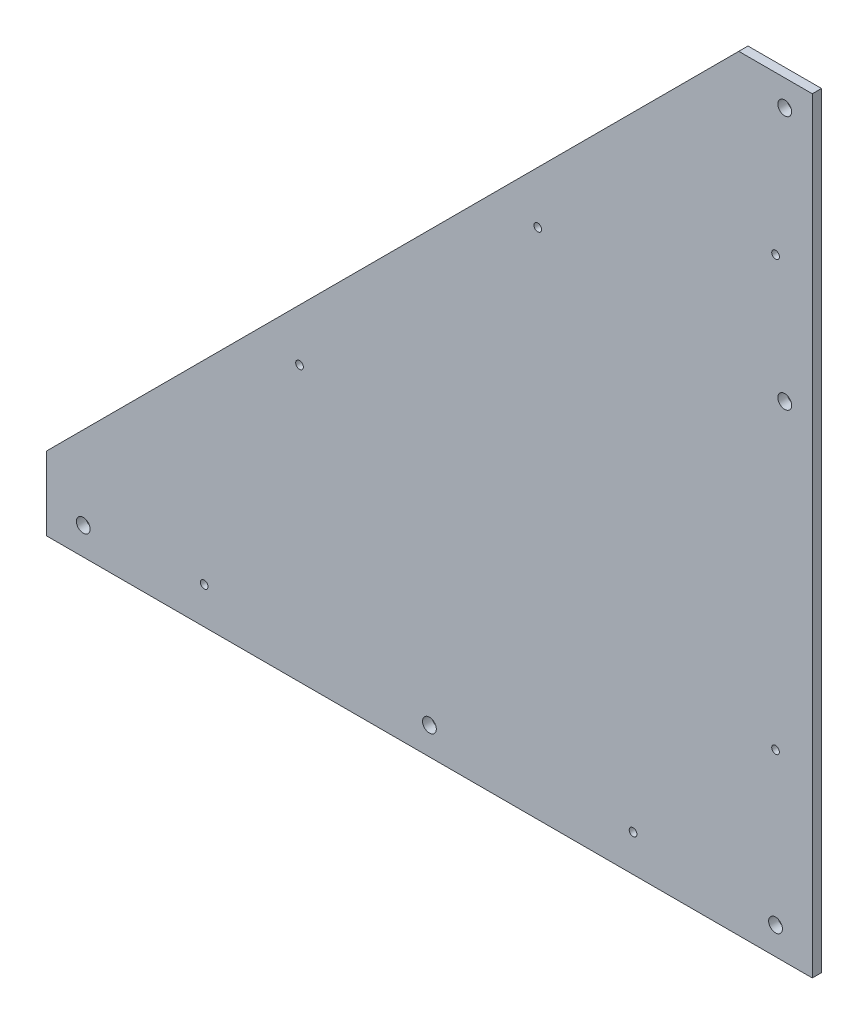
ISO-10303-21;
HEADER;
FILE_DESCRIPTION(('STEP AP214'),'2;1');
FILE_NAME('part.step','',(''),(''),'','','');
FILE_SCHEMA(('AUTOMOTIVE_DESIGN { 1 0 10303 214 1 1 1 1 }'));
ENDSEC;
DATA;
#1=APPLICATION_CONTEXT('core data for automotive mechanical design processes');
#2=APPLICATION_PROTOCOL_DEFINITION('international standard','automotive_design',2000,#1);
#3=PRODUCT_CONTEXT('',#1,'mechanical');
#4=PRODUCT('Part','Part','',(#3));
#5=PRODUCT_RELATED_PRODUCT_CATEGORY('part','',(#4));
#6=PRODUCT_DEFINITION_FORMATION('','',#4);
#7=PRODUCT_DEFINITION_CONTEXT('part definition',#1,'design');
#8=PRODUCT_DEFINITION('design','',#6,#7);
#9=PRODUCT_DEFINITION_SHAPE('','',#8);
#10=(LENGTH_UNIT() NAMED_UNIT(*) SI_UNIT(.MILLI.,.METRE.));
#11=(NAMED_UNIT(*) PLANE_ANGLE_UNIT() SI_UNIT($,.RADIAN.));
#12=(NAMED_UNIT(*) SI_UNIT($,.STERADIAN.) SOLID_ANGLE_UNIT());
#13=UNCERTAINTY_MEASURE_WITH_UNIT(LENGTH_MEASURE(1.E-05),#10,'distance_accuracy_value','');
#14=(GEOMETRIC_REPRESENTATION_CONTEXT(3) GLOBAL_UNCERTAINTY_ASSIGNED_CONTEXT((#13)) GLOBAL_UNIT_ASSIGNED_CONTEXT((#10,
#11,#12)) REPRESENTATION_CONTEXT('',''));
#15=CARTESIAN_POINT('',(0.,0.,0.));
#16=DIRECTION('',(0.,0.,1.));
#17=DIRECTION('',(1.,0.,0.));
#18=AXIS2_PLACEMENT_3D('',#15,#16,#17);
#19=CARTESIAN_POINT('',(500.,0.,6.00000000000001));
#20=DIRECTION('',(0.,1.,0.));
#21=DIRECTION('',(-1.,0.,0.));
#22=AXIS2_PLACEMENT_3D('',#19,#20,#21);
#23=PLANE('',#22);
#24=DIRECTION('',(1.,0.,0.));
#25=VECTOR('',#24,1.);
#26=CARTESIAN_POINT('',(500.,0.,0.));
#27=LINE('',#26,#25);
#28=CARTESIAN_POINT('',(0.,0.,0.));
#29=VERTEX_POINT('',#28);
#30=CARTESIAN_POINT('',(500.,0.,0.));
#31=VERTEX_POINT('',#30);
#32=EDGE_CURVE('E131',#29,#31,#27,.T.);
#33=ORIENTED_EDGE('',*,*,#32,.T.);
#34=DIRECTION('',(0.,0.,-1.));
#35=VECTOR('',#34,1.);
#36=CARTESIAN_POINT('',(500.,0.,6.00000000000001));
#37=LINE('',#36,#35);
#38=CARTESIAN_POINT('',(500.,0.,6.00000000000001));
#39=VERTEX_POINT('',#38);
#40=EDGE_CURVE('E152',#39,#31,#37,.T.);
#41=ORIENTED_EDGE('',*,*,#40,.F.);
#42=DIRECTION('',(1.,0.,0.));
#43=VECTOR('',#42,1.);
#44=CARTESIAN_POINT('',(500.,0.,6.00000000000001));
#45=LINE('',#44,#43);
#46=CARTESIAN_POINT('',(0.,0.,6.00000000000001));
#47=VERTEX_POINT('',#46);
#48=EDGE_CURVE('E145',#47,#39,#45,.T.);
#49=ORIENTED_EDGE('',*,*,#48,.F.);
#50=DIRECTION('',(0.,0.,-1.));
#51=VECTOR('',#50,1.);
#52=CARTESIAN_POINT('',(0.,0.,6.00000000000001));
#53=LINE('',#52,#51);
#54=EDGE_CURVE('E127',#47,#29,#53,.T.);
#55=ORIENTED_EDGE('',*,*,#54,.T.);
#56=EDGE_LOOP('',(#33,#41,#49,#55));
#57=FACE_BOUND('',#56,.T.);
#58=ADVANCED_FACE('F47',(#57),#23,.F.);
#59=CARTESIAN_POINT('',(500.,499.999999999995,6.00000000000001));
#60=DIRECTION('',(-1.,0.,0.));
#61=DIRECTION('',(0.,-1.,0.));
#62=AXIS2_PLACEMENT_3D('',#59,#60,#61);
#63=PLANE('',#62);
#64=DIRECTION('',(0.,1.,0.));
#65=VECTOR('',#64,1.);
#66=CARTESIAN_POINT('',(500.,499.999999999995,0.));
#67=LINE('',#66,#65);
#68=CARTESIAN_POINT('',(500.,499.999999999995,0.));
#69=VERTEX_POINT('',#68);
#70=EDGE_CURVE('E135',#31,#69,#67,.T.);
#71=ORIENTED_EDGE('',*,*,#70,.T.);
#72=DIRECTION('',(0.,0.,-1.));
#73=VECTOR('',#72,1.);
#74=CARTESIAN_POINT('',(500.,499.999999999995,6.00000000000001));
#75=LINE('',#74,#73);
#76=CARTESIAN_POINT('',(500.,499.999999999995,6.00000000000001));
#77=VERTEX_POINT('',#76);
#78=EDGE_CURVE('E119',#77,#69,#75,.T.);
#79=ORIENTED_EDGE('',*,*,#78,.F.);
#80=DIRECTION('',(0.,1.,0.));
#81=VECTOR('',#80,1.);
#82=CARTESIAN_POINT('',(500.,499.999999999995,6.00000000000001));
#83=LINE('',#82,#81);
#84=EDGE_CURVE('E101',#39,#77,#83,.T.);
#85=ORIENTED_EDGE('',*,*,#84,.F.);
#86=ORIENTED_EDGE('',*,*,#40,.T.);
#87=EDGE_LOOP('',(#71,#79,#85,#86));
#88=FACE_BOUND('',#87,.T.);
#89=ADVANCED_FACE('F250',(#88),#63,.F.);
#90=CARTESIAN_POINT('',(452.,499.999999999995,5.99999999999995));
#91=DIRECTION('',(0.,-1.,0.));
#92=DIRECTION('',(1.,0.,0.));
#93=AXIS2_PLACEMENT_3D('',#90,#91,#92);
#94=PLANE('',#93);
#95=DIRECTION('',(-1.,0.,0.));
#96=VECTOR('',#95,1.);
#97=CARTESIAN_POINT('',(452.,499.999999999995,-1.66533453693773E-13));
#98=LINE('',#97,#96);
#99=CARTESIAN_POINT('',(452.,499.999999999995,-1.66533453693773E-13));
#100=VERTEX_POINT('',#99);
#101=EDGE_CURVE('E117',#69,#100,#98,.T.);
#102=ORIENTED_EDGE('',*,*,#101,.T.);
#103=DIRECTION('',(0.,0.,-1.));
#104=VECTOR('',#103,1.);
#105=CARTESIAN_POINT('',(452.,499.999999999995,5.99999999999995));
#106=LINE('',#105,#104);
#107=CARTESIAN_POINT('',(452.,499.999999999995,5.99999999999995));
#108=VERTEX_POINT('',#107);
#109=EDGE_CURVE('E114',#108,#100,#106,.T.);
#110=ORIENTED_EDGE('',*,*,#109,.F.);
#111=DIRECTION('',(-1.,0.,0.));
#112=VECTOR('',#111,1.);
#113=CARTESIAN_POINT('',(452.,499.999999999995,5.99999999999995));
#114=LINE('',#113,#112);
#115=EDGE_CURVE('E105',#77,#108,#114,.T.);
#116=ORIENTED_EDGE('',*,*,#115,.F.);
#117=ORIENTED_EDGE('',*,*,#78,.T.);
#118=EDGE_LOOP('',(#102,#110,#116,#117));
#119=FACE_BOUND('',#118,.T.);
#120=ADVANCED_FACE('F115',(#119),#94,.F.);
#121=CARTESIAN_POINT('',(0.,48.,6.00000000000001));
#122=DIRECTION('',(0.707106781186544,-0.707106781186551,0.));
#123=DIRECTION('',(0.707106781186551,0.707106781186544,0.));
#124=AXIS2_PLACEMENT_3D('',#121,#122,#123);
#125=PLANE('',#124);
#126=DIRECTION('',(-0.707106781186551,-0.707106781186544,0.));
#127=VECTOR('',#126,1.);
#128=CARTESIAN_POINT('',(0.,48.,0.));
#129=LINE('',#128,#127);
#130=CARTESIAN_POINT('',(0.,48.,0.));
#131=VERTEX_POINT('',#130);
#132=EDGE_CURVE('E86',#100,#131,#129,.T.);
#133=ORIENTED_EDGE('',*,*,#132,.T.);
#134=DIRECTION('',(0.,0.,-1.));
#135=VECTOR('',#134,1.);
#136=CARTESIAN_POINT('',(0.,48.,6.00000000000001));
#137=LINE('',#136,#135);
#138=CARTESIAN_POINT('',(0.,48.,6.00000000000001));
#139=VERTEX_POINT('',#138);
#140=EDGE_CURVE('E120',#139,#131,#137,.T.);
#141=ORIENTED_EDGE('',*,*,#140,.F.);
#142=DIRECTION('',(-0.707106781186551,-0.707106781186544,0.));
#143=VECTOR('',#142,1.);
#144=CARTESIAN_POINT('',(0.,48.,6.00000000000001));
#145=LINE('',#144,#143);
#146=EDGE_CURVE('E109',#108,#139,#145,.T.);
#147=ORIENTED_EDGE('',*,*,#146,.F.);
#148=ORIENTED_EDGE('',*,*,#109,.T.);
#149=EDGE_LOOP('',(#133,#141,#147,#148));
#150=FACE_BOUND('',#149,.T.);
#151=ADVANCED_FACE('F122',(#150),#125,.F.);
#152=CARTESIAN_POINT('',(0.,0.,6.00000000000001));
#153=DIRECTION('',(1.,0.,0.));
#154=DIRECTION('',(0.,0.,-1.));
#155=AXIS2_PLACEMENT_3D('',#152,#153,#154);
#156=PLANE('',#155);
#157=DIRECTION('',(0.,-1.,0.));
#158=VECTOR('',#157,1.);
#159=CARTESIAN_POINT('',(0.,0.,0.));
#160=LINE('',#159,#158);
#161=EDGE_CURVE('E92',#131,#29,#160,.T.);
#162=ORIENTED_EDGE('',*,*,#161,.T.);
#163=ORIENTED_EDGE('',*,*,#54,.F.);
#164=DIRECTION('',(0.,-1.,0.));
#165=VECTOR('',#164,1.);
#166=CARTESIAN_POINT('',(0.,0.,6.00000000000001));
#167=LINE('',#166,#165);
#168=EDGE_CURVE('E66',#139,#47,#167,.T.);
#169=ORIENTED_EDGE('',*,*,#168,.F.);
#170=ORIENTED_EDGE('',*,*,#140,.T.);
#171=EDGE_LOOP('',(#162,#163,#169,#170));
#172=FACE_BOUND('',#171,.T.);
#173=ADVANCED_FACE('F239',(#172),#156,.F.);
#174=CARTESIAN_POINT('',(0.,0.,6.00000000000001));
#175=DIRECTION('',(0.,0.,-1.));
#176=DIRECTION('',(-1.,0.,0.));
#177=AXIS2_PLACEMENT_3D('',#174,#175,#176);
#178=PLANE('',#177);
#179=CARTESIAN_POINT('',(320.752308679,334.811183182041,6.00000000000001));
#180=DIRECTION('',(0.,0.,1.));
#181=DIRECTION('',(1.,0.,0.));
#182=AXIS2_PLACEMENT_3D('',#179,#180,#181);
#183=CIRCLE('',#182,2.50000000000002);
#184=CARTESIAN_POINT('',(323.252308679,334.811183182041,6.00000000000001));
#185=VERTEX_POINT('',#184);
#186=EDGE_CURVE('E307',#185,#185,#183,.T.);
#187=ORIENTED_EDGE('',*,*,#186,.F.);
#188=EDGE_LOOP('',(#187));
#189=FACE_BOUND('',#188,.T.);
#190=CARTESIAN_POINT('',(102.97056274848,23.9999999999999,5.99999999999984));
#191=DIRECTION('',(0.,0.,1.));
#192=DIRECTION('',(1.,0.,0.));
#193=AXIS2_PLACEMENT_3D('',#190,#191,#192);
#194=CIRCLE('',#193,2.5);
#195=CARTESIAN_POINT('',(105.47056274848,23.9999999999999,5.99999999999984));
#196=VERTEX_POINT('',#195);
#197=EDGE_CURVE('E315',#196,#196,#194,.T.);
#198=ORIENTED_EDGE('',*,*,#197,.F.);
#199=EDGE_LOOP('',(#198));
#200=FACE_BOUND('',#199,.T.);
#201=CARTESIAN_POINT('',(382.970562748479,24.,5.99999999999984));
#202=DIRECTION('',(0.,0.,1.));
#203=DIRECTION('',(1.,0.,0.));
#204=AXIS2_PLACEMENT_3D('',#201,#202,#203);
#205=CIRCLE('',#204,2.50000000000002);
#206=CARTESIAN_POINT('',(385.470562748479,24.,5.99999999999984));
#207=VERTEX_POINT('',#206);
#208=EDGE_CURVE('E421',#207,#207,#205,.T.);
#209=ORIENTED_EDGE('',*,*,#208,.F.);
#210=EDGE_LOOP('',(#209));
#211=FACE_BOUND('',#210,.T.);
#212=CARTESIAN_POINT('',(476.,397.029437251521,6.00000000000001));
#213=DIRECTION('',(0.,0.,1.));
#214=DIRECTION('',(1.,0.,0.));
#215=AXIS2_PLACEMENT_3D('',#212,#213,#214);
#216=CIRCLE('',#215,2.50000000000002);
#217=CARTESIAN_POINT('',(478.5,397.029437251521,6.00000000000001));
#218=VERTEX_POINT('',#217);
#219=EDGE_CURVE('E319',#218,#218,#216,.T.);
#220=ORIENTED_EDGE('',*,*,#219,.F.);
#221=EDGE_LOOP('',(#220));
#222=FACE_BOUND('',#221,.T.);
#223=CARTESIAN_POINT('',(476.,117.029437251521,6.00000000000001));
#224=DIRECTION('',(0.,0.,1.));
#225=DIRECTION('',(1.,0.,0.));
#226=AXIS2_PLACEMENT_3D('',#223,#224,#225);
#227=CIRCLE('',#226,2.50000000000002);
#228=CARTESIAN_POINT('',(478.5,117.029437251521,6.00000000000001));
#229=VERTEX_POINT('',#228);
#230=EDGE_CURVE('E414',#229,#229,#227,.T.);
#231=ORIENTED_EDGE('',*,*,#230,.F.);
#232=EDGE_LOOP('',(#231));
#233=FACE_BOUND('',#232,.T.);
#234=CARTESIAN_POINT('',(165.188816817959,179.247691321,6.00000000000001));
#235=DIRECTION('',(0.,0.,1.));
#236=DIRECTION('',(1.,0.,0.));
#237=AXIS2_PLACEMENT_3D('',#234,#235,#236);
#238=CIRCLE('',#237,2.5);
#239=CARTESIAN_POINT('',(167.688816817959,179.247691321,6.00000000000001));
#240=VERTEX_POINT('',#239);
#241=EDGE_CURVE('E304',#240,#240,#238,.T.);
#242=ORIENTED_EDGE('',*,*,#241,.F.);
#243=EDGE_LOOP('',(#242));
#244=FACE_BOUND('',#243,.T.);
#245=CARTESIAN_POINT('',(24.0000000000002,18.,5.99999999999973));
#246=DIRECTION('',(0.,0.,1.));
#247=DIRECTION('',(1.,0.,0.));
#248=AXIS2_PLACEMENT_3D('',#245,#246,#247);
#249=CIRCLE('',#248,4.5);
#250=CARTESIAN_POINT('',(28.5000000000002,18.,5.99999999999973));
#251=VERTEX_POINT('',#250);
#252=EDGE_CURVE('E323',#251,#251,#249,.T.);
#253=ORIENTED_EDGE('',*,*,#252,.F.);
#254=EDGE_LOOP('',(#253));
#255=FACE_BOUND('',#254,.T.);
#256=CARTESIAN_POINT('',(250.,18.,5.99999999999995));
#257=DIRECTION('',(0.,0.,1.));
#258=DIRECTION('',(1.,0.,0.));
#259=AXIS2_PLACEMENT_3D('',#256,#257,#258);
#260=CIRCLE('',#259,4.50000000000002);
#261=CARTESIAN_POINT('',(254.5,18.,5.99999999999995));
#262=VERTEX_POINT('',#261);
#263=EDGE_CURVE('E327',#262,#262,#260,.T.);
#264=ORIENTED_EDGE('',*,*,#263,.F.);
#265=EDGE_LOOP('',(#264));
#266=FACE_BOUND('',#265,.T.);
#267=CARTESIAN_POINT('',(476.,18.,5.99999999999992));
#268=DIRECTION('',(0.,0.,1.));
#269=DIRECTION('',(1.,0.,0.));
#270=AXIS2_PLACEMENT_3D('',#267,#268,#269);
#271=CIRCLE('',#270,4.4999999999999);
#272=CARTESIAN_POINT('',(480.5,18.,5.99999999999992));
#273=VERTEX_POINT('',#272);
#274=EDGE_CURVE('E333',#273,#273,#271,.T.);
#275=ORIENTED_EDGE('',*,*,#274,.F.);
#276=EDGE_LOOP('',(#275));
#277=FACE_BOUND('',#276,.T.);
#278=CARTESIAN_POINT('',(482.,317.,5.99999999999998));
#279=DIRECTION('',(0.,0.,1.));
#280=DIRECTION('',(1.,0.,0.));
#281=AXIS2_PLACEMENT_3D('',#278,#279,#280);
#282=CIRCLE('',#281,4.50000000000002);
#283=CARTESIAN_POINT('',(486.5,317.,5.99999999999998));
#284=VERTEX_POINT('',#283);
#285=EDGE_CURVE('E339',#284,#284,#282,.T.);
#286=ORIENTED_EDGE('',*,*,#285,.F.);
#287=EDGE_LOOP('',(#286));
#288=FACE_BOUND('',#287,.T.);
#289=CARTESIAN_POINT('',(482.,483.,6.00000000000001));
#290=DIRECTION('',(0.,0.,1.));
#291=DIRECTION('',(1.,0.,0.));
#292=AXIS2_PLACEMENT_3D('',#289,#290,#291);
#293=CIRCLE('',#292,4.50000000000002);
#294=CARTESIAN_POINT('',(486.5,483.,6.00000000000001));
#295=VERTEX_POINT('',#294);
#296=EDGE_CURVE('E312',#295,#295,#293,.T.);
#297=ORIENTED_EDGE('',*,*,#296,.F.);
#298=EDGE_LOOP('',(#297));
#299=FACE_BOUND('',#298,.T.);
#300=ORIENTED_EDGE('',*,*,#48,.T.);
#301=ORIENTED_EDGE('',*,*,#84,.T.);
#302=ORIENTED_EDGE('',*,*,#115,.T.);
#303=ORIENTED_EDGE('',*,*,#146,.T.);
#304=ORIENTED_EDGE('',*,*,#168,.T.);
#305=EDGE_LOOP('',(#300,#301,#302,#303,#304));
#306=FACE_BOUND('',#305,.T.);
#307=ADVANCED_FACE('F107',(#189,#200,#211,#222,#233,#244,#255,#266,#277,#288,#299,#306),#178,.F.);
#308=CARTESIAN_POINT('',(0.,0.,0.));
#309=DIRECTION('',(0.,0.,-1.));
#310=DIRECTION('',(-1.,0.,0.));
#311=AXIS2_PLACEMENT_3D('',#308,#309,#310);
#312=PLANE('',#311);
#313=CARTESIAN_POINT('',(476.,117.029437251521,0.));
#314=DIRECTION('',(0.,0.,-1.));
#315=DIRECTION('',(-1.,0.,0.));
#316=AXIS2_PLACEMENT_3D('',#313,#314,#315);
#317=CIRCLE('',#316,4.50000000000017);
#318=CARTESIAN_POINT('',(471.5,117.029437251521,0.));
#319=VERTEX_POINT('',#318);
#320=EDGE_CURVE('E175',#319,#319,#317,.F.);
#321=ORIENTED_EDGE('',*,*,#320,.T.);
#322=EDGE_LOOP('',(#321));
#323=FACE_BOUND('',#322,.T.);
#324=CARTESIAN_POINT('',(382.970562748479,24.,-1.66533453693773E-13));
#325=DIRECTION('',(0.,0.,-1.));
#326=DIRECTION('',(-1.,0.,0.));
#327=AXIS2_PLACEMENT_3D('',#324,#325,#326);
#328=CIRCLE('',#327,4.50000000000017);
#329=CARTESIAN_POINT('',(378.470562748479,24.,-1.66533453693773E-13));
#330=VERTEX_POINT('',#329);
#331=EDGE_CURVE('E171',#330,#330,#328,.F.);
#332=ORIENTED_EDGE('',*,*,#331,.T.);
#333=EDGE_LOOP('',(#332));
#334=FACE_BOUND('',#333,.T.);
#335=CARTESIAN_POINT('',(102.97056274848,23.9999999999999,-1.66533453693773E-13));
#336=DIRECTION('',(0.,0.,-1.));
#337=DIRECTION('',(-1.,0.,0.));
#338=AXIS2_PLACEMENT_3D('',#335,#336,#337);
#339=CIRCLE('',#338,4.50000000000017);
#340=CARTESIAN_POINT('',(98.4705627484796,23.9999999999999,-1.66533453693773E-13));
#341=VERTEX_POINT('',#340);
#342=EDGE_CURVE('E167',#341,#341,#339,.F.);
#343=ORIENTED_EDGE('',*,*,#342,.T.);
#344=EDGE_LOOP('',(#343));
#345=FACE_BOUND('',#344,.T.);
#346=CARTESIAN_POINT('',(165.18881681796,179.247691321,0.));
#347=DIRECTION('',(0.,0.,-1.));
#348=DIRECTION('',(-1.,0.,0.));
#349=AXIS2_PLACEMENT_3D('',#346,#347,#348);
#350=CIRCLE('',#349,4.50000000000017);
#351=CARTESIAN_POINT('',(160.688816817959,179.247691321,0.));
#352=VERTEX_POINT('',#351);
#353=EDGE_CURVE('E163',#352,#352,#350,.F.);
#354=ORIENTED_EDGE('',*,*,#353,.T.);
#355=EDGE_LOOP('',(#354));
#356=FACE_BOUND('',#355,.T.);
#357=CARTESIAN_POINT('',(320.752308679,334.811183182041,0.));
#358=DIRECTION('',(0.,0.,-1.));
#359=DIRECTION('',(-1.,0.,0.));
#360=AXIS2_PLACEMENT_3D('',#357,#358,#359);
#361=CIRCLE('',#360,4.50000000000017);
#362=CARTESIAN_POINT('',(316.252308679,334.811183182041,0.));
#363=VERTEX_POINT('',#362);
#364=EDGE_CURVE('E159',#363,#363,#361,.F.);
#365=ORIENTED_EDGE('',*,*,#364,.T.);
#366=EDGE_LOOP('',(#365));
#367=FACE_BOUND('',#366,.T.);
#368=CARTESIAN_POINT('',(476.,397.029437251521,0.));
#369=DIRECTION('',(0.,0.,-1.));
#370=DIRECTION('',(-1.,0.,0.));
#371=AXIS2_PLACEMENT_3D('',#368,#369,#370);
#372=CIRCLE('',#371,4.50000000000017);
#373=CARTESIAN_POINT('',(471.5,397.029437251521,0.));
#374=VERTEX_POINT('',#373);
#375=EDGE_CURVE('E155',#374,#374,#372,.F.);
#376=ORIENTED_EDGE('',*,*,#375,.T.);
#377=EDGE_LOOP('',(#376));
#378=FACE_BOUND('',#377,.T.);
#379=CARTESIAN_POINT('',(24.0000000000002,18.,-2.77555756156289E-13));
#380=DIRECTION('',(0.,0.,1.));
#381=DIRECTION('',(1.,0.,0.));
#382=AXIS2_PLACEMENT_3D('',#379,#380,#381);
#383=CIRCLE('',#382,4.5);
#384=CARTESIAN_POINT('',(28.5000000000002,18.,-2.77555756156289E-13));
#385=VERTEX_POINT('',#384);
#386=EDGE_CURVE('E136',#385,#385,#383,.T.);
#387=ORIENTED_EDGE('',*,*,#386,.T.);
#388=EDGE_LOOP('',(#387));
#389=FACE_BOUND('',#388,.T.);
#390=CARTESIAN_POINT('',(250.,18.,0.));
#391=DIRECTION('',(0.,0.,1.));
#392=DIRECTION('',(1.,0.,0.));
#393=AXIS2_PLACEMENT_3D('',#390,#391,#392);
#394=CIRCLE('',#393,4.50000000000002);
#395=CARTESIAN_POINT('',(254.5,18.,0.));
#396=VERTEX_POINT('',#395);
#397=EDGE_CURVE('E222',#396,#396,#394,.T.);
#398=ORIENTED_EDGE('',*,*,#397,.T.);
#399=EDGE_LOOP('',(#398));
#400=FACE_BOUND('',#399,.T.);
#401=CARTESIAN_POINT('',(476.,18.,0.));
#402=DIRECTION('',(0.,0.,1.));
#403=DIRECTION('',(1.,0.,0.));
#404=AXIS2_PLACEMENT_3D('',#401,#402,#403);
#405=CIRCLE('',#404,4.4999999999999);
#406=CARTESIAN_POINT('',(480.5,18.,0.));
#407=VERTEX_POINT('',#406);
#408=EDGE_CURVE('E226',#407,#407,#405,.T.);
#409=ORIENTED_EDGE('',*,*,#408,.T.);
#410=EDGE_LOOP('',(#409));
#411=FACE_BOUND('',#410,.T.);
#412=CARTESIAN_POINT('',(482.,317.,0.));
#413=DIRECTION('',(0.,0.,1.));
#414=DIRECTION('',(1.,0.,0.));
#415=AXIS2_PLACEMENT_3D('',#412,#413,#414);
#416=CIRCLE('',#415,4.50000000000002);
#417=CARTESIAN_POINT('',(486.5,317.,0.));
#418=VERTEX_POINT('',#417);
#419=EDGE_CURVE('E230',#418,#418,#416,.T.);
#420=ORIENTED_EDGE('',*,*,#419,.T.);
#421=EDGE_LOOP('',(#420));
#422=FACE_BOUND('',#421,.T.);
#423=CARTESIAN_POINT('',(482.,483.,0.));
#424=DIRECTION('',(0.,0.,1.));
#425=DIRECTION('',(1.,0.,0.));
#426=AXIS2_PLACEMENT_3D('',#423,#424,#425);
#427=CIRCLE('',#426,4.50000000000002);
#428=CARTESIAN_POINT('',(486.5,483.,0.));
#429=VERTEX_POINT('',#428);
#430=EDGE_CURVE('E234',#429,#429,#427,.T.);
#431=ORIENTED_EDGE('',*,*,#430,.T.);
#432=EDGE_LOOP('',(#431));
#433=FACE_BOUND('',#432,.T.);
#434=ORIENTED_EDGE('',*,*,#32,.F.);
#435=ORIENTED_EDGE('',*,*,#161,.F.);
#436=ORIENTED_EDGE('',*,*,#132,.F.);
#437=ORIENTED_EDGE('',*,*,#101,.F.);
#438=ORIENTED_EDGE('',*,*,#70,.F.);
#439=EDGE_LOOP('',(#434,#435,#436,#437,#438));
#440=FACE_BOUND('',#439,.T.);
#441=ADVANCED_FACE('F208',(#323,#334,#345,#356,#367,#378,#389,#400,#411,#422,#433,#440),#312,.T.);
#442=CARTESIAN_POINT('',(482.,483.,0.));
#443=DIRECTION('',(0.,0.,1.));
#444=DIRECTION('',(1.,0.,0.));
#445=AXIS2_PLACEMENT_3D('',#442,#443,#444);
#446=CYLINDRICAL_SURFACE('',#445,4.50000000000002);
#447=ORIENTED_EDGE('',*,*,#430,.F.);
#448=EDGE_LOOP('',(#447));
#449=FACE_BOUND('',#448,.T.);
#450=ORIENTED_EDGE('',*,*,#296,.T.);
#451=EDGE_LOOP('',(#450));
#452=FACE_BOUND('',#451,.T.);
#453=ADVANCED_FACE('F211',(#449,#452),#446,.F.);
#454=CARTESIAN_POINT('',(482.,317.,0.));
#455=DIRECTION('',(0.,0.,1.));
#456=DIRECTION('',(1.,0.,0.));
#457=AXIS2_PLACEMENT_3D('',#454,#455,#456);
#458=CYLINDRICAL_SURFACE('',#457,4.50000000000002);
#459=ORIENTED_EDGE('',*,*,#419,.F.);
#460=EDGE_LOOP('',(#459));
#461=FACE_BOUND('',#460,.T.);
#462=ORIENTED_EDGE('',*,*,#285,.T.);
#463=EDGE_LOOP('',(#462));
#464=FACE_BOUND('',#463,.T.);
#465=ADVANCED_FACE('F372',(#461,#464),#458,.F.);
#466=CARTESIAN_POINT('',(476.,18.,0.));
#467=DIRECTION('',(0.,0.,1.));
#468=DIRECTION('',(1.,0.,0.));
#469=AXIS2_PLACEMENT_3D('',#466,#467,#468);
#470=CYLINDRICAL_SURFACE('',#469,4.4999999999999);
#471=ORIENTED_EDGE('',*,*,#408,.F.);
#472=EDGE_LOOP('',(#471));
#473=FACE_BOUND('',#472,.T.);
#474=ORIENTED_EDGE('',*,*,#274,.T.);
#475=EDGE_LOOP('',(#474));
#476=FACE_BOUND('',#475,.T.);
#477=ADVANCED_FACE('F378',(#473,#476),#470,.F.);
#478=CARTESIAN_POINT('',(250.,18.,0.));
#479=DIRECTION('',(0.,0.,1.));
#480=DIRECTION('',(1.,0.,0.));
#481=AXIS2_PLACEMENT_3D('',#478,#479,#480);
#482=CYLINDRICAL_SURFACE('',#481,4.50000000000002);
#483=ORIENTED_EDGE('',*,*,#397,.F.);
#484=EDGE_LOOP('',(#483));
#485=FACE_BOUND('',#484,.T.);
#486=ORIENTED_EDGE('',*,*,#263,.T.);
#487=EDGE_LOOP('',(#486));
#488=FACE_BOUND('',#487,.T.);
#489=ADVANCED_FACE('F384',(#485,#488),#482,.F.);
#490=CARTESIAN_POINT('',(24.0000000000002,18.,-2.77555756156289E-13));
#491=DIRECTION('',(0.,0.,1.));
#492=DIRECTION('',(1.,0.,0.));
#493=AXIS2_PLACEMENT_3D('',#490,#491,#492);
#494=CYLINDRICAL_SURFACE('',#493,4.5);
#495=ORIENTED_EDGE('',*,*,#386,.F.);
#496=EDGE_LOOP('',(#495));
#497=FACE_BOUND('',#496,.T.);
#498=ORIENTED_EDGE('',*,*,#252,.T.);
#499=EDGE_LOOP('',(#498));
#500=FACE_BOUND('',#499,.T.);
#501=ADVANCED_FACE('F300',(#497,#500),#494,.F.);
#502=CARTESIAN_POINT('',(165.18881681796,179.247691321,0.));
#503=DIRECTION('',(0.,0.,1.));
#504=DIRECTION('',(1.,0.,0.));
#505=AXIS2_PLACEMENT_3D('',#502,#503,#504);
#506=CYLINDRICAL_SURFACE('',#505,2.5);
#507=CARTESIAN_POINT('',(165.18881681796,179.247691321,2.00000000000017));
#508=DIRECTION('',(0.,0.,-1.));
#509=DIRECTION('',(-1.,0.,0.));
#510=AXIS2_PLACEMENT_3D('',#507,#508,#509);
#511=CIRCLE('',#510,2.5);
#512=CARTESIAN_POINT('',(162.68881681796,179.247691321,2.00000000000017));
#513=VERTEX_POINT('',#512);
#514=EDGE_CURVE('E191',#513,#513,#511,.T.);
#515=ORIENTED_EDGE('',*,*,#514,.T.);
#516=EDGE_LOOP('',(#515));
#517=FACE_BOUND('',#516,.T.);
#518=ORIENTED_EDGE('',*,*,#241,.T.);
#519=EDGE_LOOP('',(#518));
#520=FACE_BOUND('',#519,.T.);
#521=ADVANCED_FACE('F296',(#517,#520),#506,.F.);
#522=CARTESIAN_POINT('',(476.,117.029437251521,0.));
#523=DIRECTION('',(0.,0.,1.));
#524=DIRECTION('',(1.,0.,0.));
#525=AXIS2_PLACEMENT_3D('',#522,#523,#524);
#526=CYLINDRICAL_SURFACE('',#525,2.50000000000002);
#527=CARTESIAN_POINT('',(476.,117.029437251521,2.00000000000014));
#528=DIRECTION('',(0.,0.,-1.));
#529=DIRECTION('',(-1.,0.,0.));
#530=AXIS2_PLACEMENT_3D('',#527,#528,#529);
#531=CIRCLE('',#530,2.50000000000002);
#532=CARTESIAN_POINT('',(473.5,117.029437251521,2.00000000000014));
#533=VERTEX_POINT('',#532);
#534=EDGE_CURVE('E179',#533,#533,#531,.T.);
#535=ORIENTED_EDGE('',*,*,#534,.T.);
#536=EDGE_LOOP('',(#535));
#537=FACE_BOUND('',#536,.T.);
#538=ORIENTED_EDGE('',*,*,#230,.T.);
#539=EDGE_LOOP('',(#538));
#540=FACE_BOUND('',#539,.T.);
#541=ADVANCED_FACE('F299',(#537,#540),#526,.F.);
#542=CARTESIAN_POINT('',(476.,397.029437251521,0.));
#543=DIRECTION('',(0.,0.,1.));
#544=DIRECTION('',(1.,0.,0.));
#545=AXIS2_PLACEMENT_3D('',#542,#543,#544);
#546=CYLINDRICAL_SURFACE('',#545,2.50000000000002);
#547=CARTESIAN_POINT('',(476.,397.029437251521,2.00000000000014));
#548=DIRECTION('',(0.,0.,-1.));
#549=DIRECTION('',(-1.,0.,0.));
#550=AXIS2_PLACEMENT_3D('',#547,#548,#549);
#551=CIRCLE('',#550,2.50000000000002);
#552=CARTESIAN_POINT('',(473.5,397.029437251521,2.00000000000014));
#553=VERTEX_POINT('',#552);
#554=EDGE_CURVE('E11',#553,#553,#551,.T.);
#555=ORIENTED_EDGE('',*,*,#554,.T.);
#556=EDGE_LOOP('',(#555));
#557=FACE_BOUND('',#556,.T.);
#558=ORIENTED_EDGE('',*,*,#219,.T.);
#559=EDGE_LOOP('',(#558));
#560=FACE_BOUND('',#559,.T.);
#561=ADVANCED_FACE('F392',(#557,#560),#546,.F.);
#562=CARTESIAN_POINT('',(382.970562748479,24.,-1.66533453693773E-13));
#563=DIRECTION('',(0.,0.,1.));
#564=DIRECTION('',(1.,0.,0.));
#565=AXIS2_PLACEMENT_3D('',#562,#563,#564);
#566=CYLINDRICAL_SURFACE('',#565,2.50000000000002);
#567=CARTESIAN_POINT('',(382.970562748479,24.,2.));
#568=DIRECTION('',(0.,0.,-1.));
#569=DIRECTION('',(-1.,0.,0.));
#570=AXIS2_PLACEMENT_3D('',#567,#568,#569);
#571=CIRCLE('',#570,2.50000000000002);
#572=CARTESIAN_POINT('',(380.470562748479,24.,2.));
#573=VERTEX_POINT('',#572);
#574=EDGE_CURVE('E183',#573,#573,#571,.T.);
#575=ORIENTED_EDGE('',*,*,#574,.T.);
#576=EDGE_LOOP('',(#575));
#577=FACE_BOUND('',#576,.T.);
#578=ORIENTED_EDGE('',*,*,#208,.T.);
#579=EDGE_LOOP('',(#578));
#580=FACE_BOUND('',#579,.T.);
#581=ADVANCED_FACE('F395',(#577,#580),#566,.F.);
#582=CARTESIAN_POINT('',(102.97056274848,23.9999999999999,-1.66533453693773E-13));
#583=DIRECTION('',(0.,0.,1.));
#584=DIRECTION('',(1.,0.,0.));
#585=AXIS2_PLACEMENT_3D('',#582,#583,#584);
#586=CYLINDRICAL_SURFACE('',#585,2.5);
#587=CARTESIAN_POINT('',(102.97056274848,23.9999999999999,2.00000000000003));
#588=DIRECTION('',(0.,0.,-1.));
#589=DIRECTION('',(-1.,0.,0.));
#590=AXIS2_PLACEMENT_3D('',#587,#588,#589);
#591=CIRCLE('',#590,2.5);
#592=CARTESIAN_POINT('',(100.47056274848,23.9999999999999,2.00000000000003));
#593=VERTEX_POINT('',#592);
#594=EDGE_CURVE('E187',#593,#593,#591,.T.);
#595=ORIENTED_EDGE('',*,*,#594,.T.);
#596=EDGE_LOOP('',(#595));
#597=FACE_BOUND('',#596,.T.);
#598=ORIENTED_EDGE('',*,*,#197,.T.);
#599=EDGE_LOOP('',(#598));
#600=FACE_BOUND('',#599,.T.);
#601=ADVANCED_FACE('F399',(#597,#600),#586,.F.);
#602=CARTESIAN_POINT('',(320.752308679,334.811183182041,0.));
#603=DIRECTION('',(0.,0.,1.));
#604=DIRECTION('',(1.,0.,0.));
#605=AXIS2_PLACEMENT_3D('',#602,#603,#604);
#606=CYLINDRICAL_SURFACE('',#605,2.50000000000002);
#607=CARTESIAN_POINT('',(320.752308679,334.811183182041,2.00000000000014));
#608=DIRECTION('',(0.,0.,-1.));
#609=DIRECTION('',(-1.,0.,0.));
#610=AXIS2_PLACEMENT_3D('',#607,#608,#609);
#611=CIRCLE('',#610,2.50000000000002);
#612=CARTESIAN_POINT('',(318.252308679,334.811183182041,2.00000000000014));
#613=VERTEX_POINT('',#612);
#614=EDGE_CURVE('E58',#613,#613,#611,.T.);
#615=ORIENTED_EDGE('',*,*,#614,.T.);
#616=EDGE_LOOP('',(#615));
#617=FACE_BOUND('',#616,.T.);
#618=ORIENTED_EDGE('',*,*,#186,.T.);
#619=EDGE_LOOP('',(#618));
#620=FACE_BOUND('',#619,.T.);
#621=ADVANCED_FACE('F199',(#617,#620),#606,.F.);
#622=CARTESIAN_POINT('',(476.,117.029437251521,0.));
#623=DIRECTION('',(0.,0.,-1.));
#624=DIRECTION('',(-1.,0.,0.));
#625=AXIS2_PLACEMENT_3D('',#622,#623,#624);
#626=CONICAL_SURFACE('',#625,4.50000000000017,0.785398163397446);
#627=ORIENTED_EDGE('',*,*,#534,.F.);
#628=EDGE_LOOP('',(#627));
#629=FACE_BOUND('',#628,.T.);
#630=ORIENTED_EDGE('',*,*,#320,.F.);
#631=EDGE_LOOP('',(#630));
#632=FACE_BOUND('',#631,.T.);
#633=ADVANCED_FACE('F259',(#629,#632),#626,.F.);
#634=CARTESIAN_POINT('',(382.970562748479,24.,-1.66533453693773E-13));
#635=DIRECTION('',(0.,0.,-1.));
#636=DIRECTION('',(-1.,0.,0.));
#637=AXIS2_PLACEMENT_3D('',#634,#635,#636);
#638=CONICAL_SURFACE('',#637,4.50000000000017,0.785398163397446);
#639=ORIENTED_EDGE('',*,*,#574,.F.);
#640=EDGE_LOOP('',(#639));
#641=FACE_BOUND('',#640,.T.);
#642=ORIENTED_EDGE('',*,*,#331,.F.);
#643=EDGE_LOOP('',(#642));
#644=FACE_BOUND('',#643,.T.);
#645=ADVANCED_FACE('F265',(#641,#644),#638,.F.);
#646=CARTESIAN_POINT('',(102.97056274848,23.9999999999999,-1.66533453693773E-13));
#647=DIRECTION('',(0.,0.,-1.));
#648=DIRECTION('',(-1.,0.,0.));
#649=AXIS2_PLACEMENT_3D('',#646,#647,#648);
#650=CONICAL_SURFACE('',#649,4.50000000000017,0.785398163397446);
#651=ORIENTED_EDGE('',*,*,#594,.F.);
#652=EDGE_LOOP('',(#651));
#653=FACE_BOUND('',#652,.T.);
#654=ORIENTED_EDGE('',*,*,#342,.F.);
#655=EDGE_LOOP('',(#654));
#656=FACE_BOUND('',#655,.T.);
#657=ADVANCED_FACE('F272',(#653,#656),#650,.F.);
#658=CARTESIAN_POINT('',(165.18881681796,179.247691321,0.));
#659=DIRECTION('',(0.,0.,-1.));
#660=DIRECTION('',(-1.,0.,0.));
#661=AXIS2_PLACEMENT_3D('',#658,#659,#660);
#662=CONICAL_SURFACE('',#661,4.50000000000017,0.785398163397446);
#663=ORIENTED_EDGE('',*,*,#514,.F.);
#664=EDGE_LOOP('',(#663));
#665=FACE_BOUND('',#664,.T.);
#666=ORIENTED_EDGE('',*,*,#353,.F.);
#667=EDGE_LOOP('',(#666));
#668=FACE_BOUND('',#667,.T.);
#669=ADVANCED_FACE('F205',(#665,#668),#662,.F.);
#670=CARTESIAN_POINT('',(320.752308679,334.811183182041,0.));
#671=DIRECTION('',(0.,0.,-1.));
#672=DIRECTION('',(-1.,0.,0.));
#673=AXIS2_PLACEMENT_3D('',#670,#671,#672);
#674=CONICAL_SURFACE('',#673,4.50000000000017,0.785398163397446);
#675=ORIENTED_EDGE('',*,*,#614,.F.);
#676=EDGE_LOOP('',(#675));
#677=FACE_BOUND('',#676,.T.);
#678=ORIENTED_EDGE('',*,*,#364,.F.);
#679=EDGE_LOOP('',(#678));
#680=FACE_BOUND('',#679,.T.);
#681=ADVANCED_FACE('F202',(#677,#680),#674,.F.);
#682=CARTESIAN_POINT('',(476.,397.029437251521,0.));
#683=DIRECTION('',(0.,0.,-1.));
#684=DIRECTION('',(-1.,0.,0.));
#685=AXIS2_PLACEMENT_3D('',#682,#683,#684);
#686=CONICAL_SURFACE('',#685,4.50000000000017,0.785398163397446);
#687=ORIENTED_EDGE('',*,*,#554,.F.);
#688=EDGE_LOOP('',(#687));
#689=FACE_BOUND('',#688,.T.);
#690=ORIENTED_EDGE('',*,*,#375,.F.);
#691=EDGE_LOOP('',(#690));
#692=FACE_BOUND('',#691,.T.);
#693=ADVANCED_FACE('F50',(#689,#692),#686,.F.);
#694=CLOSED_SHELL('',(#58,#89,#120,#151,#173,#307,#441,#453,#465,#477,#489,#501,#521,#541,#561,
#581,#601,#621,#633,#645,#657,#669,#681,#693));
#695=MANIFOLD_SOLID_BREP('B2',#694);
#696=ADVANCED_BREP_SHAPE_REPRESENTATION('',(#18,#695),#14);
#697=SHAPE_DEFINITION_REPRESENTATION(#9,#696);
ENDSEC;
END-ISO-10303-21;
